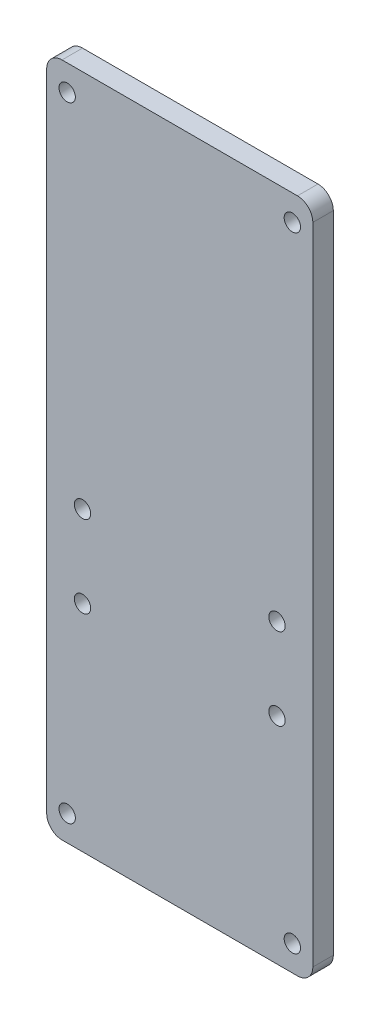
ISO-10303-21;
HEADER;
FILE_DESCRIPTION(('STEP AP214'),'2;1');
FILE_NAME('part.step','',(''),(''),'','','');
FILE_SCHEMA(('AUTOMOTIVE_DESIGN { 1 0 10303 214 1 1 1 1 }'));
ENDSEC;
DATA;
#1=APPLICATION_CONTEXT('core data for automotive mechanical design processes');
#2=APPLICATION_PROTOCOL_DEFINITION('international standard','automotive_design',2000,#1);
#3=PRODUCT_CONTEXT('',#1,'mechanical');
#4=PRODUCT('Part','Part','',(#3));
#5=PRODUCT_RELATED_PRODUCT_CATEGORY('part','',(#4));
#6=PRODUCT_DEFINITION_FORMATION('','',#4);
#7=PRODUCT_DEFINITION_CONTEXT('part definition',#1,'design');
#8=PRODUCT_DEFINITION('design','',#6,#7);
#9=PRODUCT_DEFINITION_SHAPE('','',#8);
#10=(LENGTH_UNIT() NAMED_UNIT(*) SI_UNIT(.MILLI.,.METRE.));
#11=(NAMED_UNIT(*) PLANE_ANGLE_UNIT() SI_UNIT($,.RADIAN.));
#12=(NAMED_UNIT(*) SI_UNIT($,.STERADIAN.) SOLID_ANGLE_UNIT());
#13=UNCERTAINTY_MEASURE_WITH_UNIT(LENGTH_MEASURE(1.E-05),#10,'distance_accuracy_value','');
#14=(GEOMETRIC_REPRESENTATION_CONTEXT(3) GLOBAL_UNCERTAINTY_ASSIGNED_CONTEXT((#13)) GLOBAL_UNIT_ASSIGNED_CONTEXT((#10,
#11,#12)) REPRESENTATION_CONTEXT('',''));
#15=CARTESIAN_POINT('',(0.,0.,0.));
#16=DIRECTION('',(0.,0.,1.));
#17=DIRECTION('',(1.,0.,0.));
#18=AXIS2_PLACEMENT_3D('',#15,#16,#17);
#19=CARTESIAN_POINT('',(72.2085191761689,-1.06360829735305,4.));
#20=DIRECTION('',(0.,0.,1.));
#21=DIRECTION('',(1.,0.,0.));
#22=AXIS2_PLACEMENT_3D('',#19,#20,#21);
#23=PLANE('',#22);
#24=CARTESIAN_POINT('',(71.2085191761689,0.936391702646949,4.));
#25=DIRECTION('',(0.,0.,1.));
#26=DIRECTION('',(-1.,0.,0.));
#27=AXIS2_PLACEMENT_3D('',#24,#25,#26);
#28=CIRCLE('',#27,1.60000000000001);
#29=CARTESIAN_POINT('',(69.6085191761689,0.936391702646949,4.));
#30=VERTEX_POINT('',#29);
#31=EDGE_CURVE('E211',#30,#30,#28,.T.);
#32=ORIENTED_EDGE('',*,*,#31,.F.);
#33=EDGE_LOOP('',(#32));
#34=FACE_BOUND('',#33,.T.);
#35=CARTESIAN_POINT('',(30.2077302302811,37.936391702647,4.));
#36=DIRECTION('',(0.,0.,1.));
#37=DIRECTION('',(1.,0.,0.));
#38=AXIS2_PLACEMENT_3D('',#35,#36,#37);
#39=CIRCLE('',#38,1.60000000000001);
#40=CARTESIAN_POINT('',(31.8077302302811,37.936391702647,4.));
#41=VERTEX_POINT('',#40);
#42=EDGE_CURVE('E199',#41,#41,#39,.T.);
#43=ORIENTED_EDGE('',*,*,#42,.F.);
#44=EDGE_LOOP('',(#43));
#45=FACE_BOUND('',#44,.T.);
#46=CARTESIAN_POINT('',(71.2085191761689,122.936391702647,4.));
#47=DIRECTION('',(0.,0.,1.));
#48=DIRECTION('',(1.,0.,0.));
#49=AXIS2_PLACEMENT_3D('',#46,#47,#48);
#50=CIRCLE('',#49,1.60000000000001);
#51=CARTESIAN_POINT('',(72.8085191761689,122.936391702647,4.));
#52=VERTEX_POINT('',#51);
#53=EDGE_CURVE('E187',#52,#52,#50,.T.);
#54=ORIENTED_EDGE('',*,*,#53,.F.);
#55=EDGE_LOOP('',(#54));
#56=FACE_BOUND('',#55,.T.);
#57=CARTESIAN_POINT('',(30.2077302302811,53.936391702647,4.));
#58=DIRECTION('',(0.,0.,1.));
#59=DIRECTION('',(1.,0.,0.));
#60=AXIS2_PLACEMENT_3D('',#57,#58,#59);
#61=CIRCLE('',#60,1.60000000000001);
#62=CARTESIAN_POINT('',(31.8077302302811,53.936391702647,4.));
#63=VERTEX_POINT('',#62);
#64=EDGE_CURVE('E133',#63,#63,#61,.T.);
#65=ORIENTED_EDGE('',*,*,#64,.F.);
#66=EDGE_LOOP('',(#65));
#67=FACE_BOUND('',#66,.T.);
#68=CARTESIAN_POINT('',(72.2085191761689,-1.06360829735305,4.));
#69=DIRECTION('',(0.,0.,1.));
#70=DIRECTION('',(1.,0.,0.));
#71=AXIS2_PLACEMENT_3D('',#68,#69,#70);
#72=CIRCLE('',#71,2.99999999999999);
#73=CARTESIAN_POINT('',(72.2085191761689,-4.06360829735305,4.));
#74=VERTEX_POINT('',#73);
#75=CARTESIAN_POINT('',(75.2085191761689,-1.06360829735305,4.));
#76=VERTEX_POINT('',#75);
#77=EDGE_CURVE('E144',#74,#76,#72,.T.);
#78=ORIENTED_EDGE('',*,*,#77,.T.);
#79=DIRECTION('',(0.,1.,0.));
#80=VECTOR('',#79,1.);
#81=CARTESIAN_POINT('',(75.2085191761689,124.936391702647,4.));
#82=LINE('',#81,#80);
#83=CARTESIAN_POINT('',(75.2085191761689,124.936391702647,4.));
#84=VERTEX_POINT('',#83);
#85=EDGE_CURVE('E92',#76,#84,#82,.T.);
#86=ORIENTED_EDGE('',*,*,#85,.T.);
#87=CARTESIAN_POINT('',(72.2085191761689,124.936391702647,4.));
#88=DIRECTION('',(0.,0.,1.));
#89=DIRECTION('',(-1.,0.,0.));
#90=AXIS2_PLACEMENT_3D('',#87,#88,#89);
#91=CIRCLE('',#90,3.);
#92=CARTESIAN_POINT('',(72.2085191761689,127.936391702647,4.));
#93=VERTEX_POINT('',#92);
#94=EDGE_CURVE('E159',#84,#93,#91,.T.);
#95=ORIENTED_EDGE('',*,*,#94,.T.);
#96=DIRECTION('',(-1.,0.,0.));
#97=VECTOR('',#96,1.);
#98=CARTESIAN_POINT('',(26.2069412843933,127.936391702647,4.));
#99=LINE('',#98,#97);
#100=CARTESIAN_POINT('',(26.2069412843933,127.936391702647,4.));
#101=VERTEX_POINT('',#100);
#102=EDGE_CURVE('E172',#93,#101,#99,.T.);
#103=ORIENTED_EDGE('',*,*,#102,.T.);
#104=CARTESIAN_POINT('',(26.2069412843933,124.936391702647,4.));
#105=DIRECTION('',(0.,0.,1.));
#106=DIRECTION('',(1.,0.,0.));
#107=AXIS2_PLACEMENT_3D('',#104,#105,#106);
#108=CIRCLE('',#107,3.);
#109=CARTESIAN_POINT('',(23.2069412843933,124.936391702647,4.));
#110=VERTEX_POINT('',#109);
#111=EDGE_CURVE('E111',#101,#110,#108,.T.);
#112=ORIENTED_EDGE('',*,*,#111,.T.);
#113=DIRECTION('',(0.,-1.,0.));
#114=VECTOR('',#113,1.);
#115=CARTESIAN_POINT('',(23.2069412843933,124.936391702647,4.));
#116=LINE('',#115,#114);
#117=CARTESIAN_POINT('',(23.2069412843933,-1.06360829735305,4.));
#118=VERTEX_POINT('',#117);
#119=EDGE_CURVE('E105',#110,#118,#116,.T.);
#120=ORIENTED_EDGE('',*,*,#119,.T.);
#121=CARTESIAN_POINT('',(26.2069412843933,-1.06360829735305,4.));
#122=DIRECTION('',(0.,0.,1.));
#123=DIRECTION('',(-1.,0.,0.));
#124=AXIS2_PLACEMENT_3D('',#121,#122,#123);
#125=CIRCLE('',#124,2.99999999999999);
#126=CARTESIAN_POINT('',(26.2069412843933,-4.06360829735305,4.));
#127=VERTEX_POINT('',#126);
#128=EDGE_CURVE('E109',#118,#127,#125,.T.);
#129=ORIENTED_EDGE('',*,*,#128,.T.);
#130=DIRECTION('',(1.,0.,0.));
#131=VECTOR('',#130,1.);
#132=CARTESIAN_POINT('',(26.2069412843933,-4.06360829735305,4.));
#133=LINE('',#132,#131);
#134=EDGE_CURVE('E49',#127,#74,#133,.T.);
#135=ORIENTED_EDGE('',*,*,#134,.T.);
#136=EDGE_LOOP('',(#78,#86,#95,#103,#112,#120,#129,#135));
#137=FACE_BOUND('',#136,.T.);
#138=CARTESIAN_POINT('',(27.2069412843933,0.936391702646949,4.));
#139=DIRECTION('',(0.,0.,1.));
#140=DIRECTION('',(1.,0.,0.));
#141=AXIS2_PLACEMENT_3D('',#138,#139,#140);
#142=CIRCLE('',#141,1.60000000000001);
#143=CARTESIAN_POINT('',(28.8069412843933,0.936391702646949,4.));
#144=VERTEX_POINT('',#143);
#145=EDGE_CURVE('E181',#144,#144,#142,.T.);
#146=ORIENTED_EDGE('',*,*,#145,.F.);
#147=EDGE_LOOP('',(#146));
#148=FACE_BOUND('',#147,.T.);
#149=CARTESIAN_POINT('',(27.2069412843933,122.936391702647,4.));
#150=DIRECTION('',(0.,0.,1.));
#151=DIRECTION('',(-1.,0.,0.));
#152=AXIS2_PLACEMENT_3D('',#149,#150,#151);
#153=CIRCLE('',#152,1.60000000000001);
#154=CARTESIAN_POINT('',(25.6069412843933,122.936391702647,4.));
#155=VERTEX_POINT('',#154);
#156=EDGE_CURVE('E193',#155,#155,#153,.T.);
#157=ORIENTED_EDGE('',*,*,#156,.F.);
#158=EDGE_LOOP('',(#157));
#159=FACE_BOUND('',#158,.T.);
#160=CARTESIAN_POINT('',(68.2077302302811,37.936391702647,4.));
#161=DIRECTION('',(0.,0.,1.));
#162=DIRECTION('',(1.,0.,0.));
#163=AXIS2_PLACEMENT_3D('',#160,#161,#162);
#164=CIRCLE('',#163,1.60000000000001);
#165=CARTESIAN_POINT('',(69.8077302302811,37.936391702647,4.));
#166=VERTEX_POINT('',#165);
#167=EDGE_CURVE('E205',#166,#166,#164,.T.);
#168=ORIENTED_EDGE('',*,*,#167,.F.);
#169=EDGE_LOOP('',(#168));
#170=FACE_BOUND('',#169,.T.);
#171=CARTESIAN_POINT('',(68.2077302302811,53.936391702647,4.));
#172=DIRECTION('',(0.,0.,1.));
#173=DIRECTION('',(-1.,0.,0.));
#174=AXIS2_PLACEMENT_3D('',#171,#172,#173);
#175=CIRCLE('',#174,1.60000000000001);
#176=CARTESIAN_POINT('',(66.6077302302811,53.936391702647,4.));
#177=VERTEX_POINT('',#176);
#178=EDGE_CURVE('E217',#177,#177,#175,.T.);
#179=ORIENTED_EDGE('',*,*,#178,.F.);
#180=EDGE_LOOP('',(#179));
#181=FACE_BOUND('',#180,.T.);
#182=ADVANCED_FACE('F32',(#34,#45,#56,#67,#137,#148,#159,#170,#181),#23,.T.);
#183=CARTESIAN_POINT('',(72.2085191761689,-1.06360829735305,0.));
#184=DIRECTION('',(0.,0.,1.));
#185=DIRECTION('',(1.,0.,0.));
#186=AXIS2_PLACEMENT_3D('',#183,#184,#185);
#187=PLANE('',#186);
#188=CARTESIAN_POINT('',(71.2085191761689,0.936391702646949,0.));
#189=DIRECTION('',(0.,0.,1.));
#190=DIRECTION('',(-1.,0.,0.));
#191=AXIS2_PLACEMENT_3D('',#188,#189,#190);
#192=CIRCLE('',#191,1.60000000000001);
#193=CARTESIAN_POINT('',(69.6085191761689,0.936391702646949,0.));
#194=VERTEX_POINT('',#193);
#195=EDGE_CURVE('E214',#194,#194,#192,.T.);
#196=ORIENTED_EDGE('',*,*,#195,.T.);
#197=EDGE_LOOP('',(#196));
#198=FACE_BOUND('',#197,.T.);
#199=CARTESIAN_POINT('',(30.2077302302811,37.936391702647,0.));
#200=DIRECTION('',(0.,0.,1.));
#201=DIRECTION('',(1.,0.,0.));
#202=AXIS2_PLACEMENT_3D('',#199,#200,#201);
#203=CIRCLE('',#202,1.60000000000001);
#204=CARTESIAN_POINT('',(31.8077302302811,37.936391702647,0.));
#205=VERTEX_POINT('',#204);
#206=EDGE_CURVE('E202',#205,#205,#203,.T.);
#207=ORIENTED_EDGE('',*,*,#206,.T.);
#208=EDGE_LOOP('',(#207));
#209=FACE_BOUND('',#208,.T.);
#210=CARTESIAN_POINT('',(71.2085191761689,122.936391702647,0.));
#211=DIRECTION('',(0.,0.,1.));
#212=DIRECTION('',(1.,0.,0.));
#213=AXIS2_PLACEMENT_3D('',#210,#211,#212);
#214=CIRCLE('',#213,1.60000000000001);
#215=CARTESIAN_POINT('',(72.8085191761689,122.936391702647,0.));
#216=VERTEX_POINT('',#215);
#217=EDGE_CURVE('E190',#216,#216,#214,.T.);
#218=ORIENTED_EDGE('',*,*,#217,.T.);
#219=EDGE_LOOP('',(#218));
#220=FACE_BOUND('',#219,.T.);
#221=CARTESIAN_POINT('',(30.2077302302811,53.936391702647,0.));
#222=DIRECTION('',(0.,0.,1.));
#223=DIRECTION('',(1.,0.,0.));
#224=AXIS2_PLACEMENT_3D('',#221,#222,#223);
#225=CIRCLE('',#224,1.60000000000001);
#226=CARTESIAN_POINT('',(31.8077302302811,53.936391702647,0.));
#227=VERTEX_POINT('',#226);
#228=EDGE_CURVE('E178',#227,#227,#225,.T.);
#229=ORIENTED_EDGE('',*,*,#228,.T.);
#230=EDGE_LOOP('',(#229));
#231=FACE_BOUND('',#230,.T.);
#232=CARTESIAN_POINT('',(72.2085191761689,-1.06360829735305,0.));
#233=DIRECTION('',(0.,0.,1.));
#234=DIRECTION('',(1.,0.,0.));
#235=AXIS2_PLACEMENT_3D('',#232,#233,#234);
#236=CIRCLE('',#235,2.99999999999999);
#237=CARTESIAN_POINT('',(72.2085191761689,-4.06360829735305,0.));
#238=VERTEX_POINT('',#237);
#239=CARTESIAN_POINT('',(75.2085191761689,-1.06360829735305,0.));
#240=VERTEX_POINT('',#239);
#241=EDGE_CURVE('E129',#238,#240,#236,.T.);
#242=ORIENTED_EDGE('',*,*,#241,.F.);
#243=DIRECTION('',(1.,0.,0.));
#244=VECTOR('',#243,1.);
#245=CARTESIAN_POINT('',(26.2069412843933,-4.06360829735305,0.));
#246=LINE('',#245,#244);
#247=CARTESIAN_POINT('',(26.2069412843933,-4.06360829735305,0.));
#248=VERTEX_POINT('',#247);
#249=EDGE_CURVE('E84',#248,#238,#246,.T.);
#250=ORIENTED_EDGE('',*,*,#249,.F.);
#251=CARTESIAN_POINT('',(26.2069412843933,-1.06360829735305,0.));
#252=DIRECTION('',(0.,0.,1.));
#253=DIRECTION('',(-1.,0.,0.));
#254=AXIS2_PLACEMENT_3D('',#251,#252,#253);
#255=CIRCLE('',#254,2.99999999999999);
#256=CARTESIAN_POINT('',(23.2069412843933,-1.06360829735305,0.));
#257=VERTEX_POINT('',#256);
#258=EDGE_CURVE('E78',#257,#248,#255,.T.);
#259=ORIENTED_EDGE('',*,*,#258,.F.);
#260=DIRECTION('',(0.,-1.,0.));
#261=VECTOR('',#260,1.);
#262=CARTESIAN_POINT('',(23.2069412843933,124.936391702647,0.));
#263=LINE('',#262,#261);
#264=CARTESIAN_POINT('',(23.2069412843933,124.936391702647,0.));
#265=VERTEX_POINT('',#264);
#266=EDGE_CURVE('E119',#265,#257,#263,.T.);
#267=ORIENTED_EDGE('',*,*,#266,.F.);
#268=CARTESIAN_POINT('',(26.2069412843933,124.936391702647,0.));
#269=DIRECTION('',(0.,0.,1.));
#270=DIRECTION('',(1.,0.,0.));
#271=AXIS2_PLACEMENT_3D('',#268,#269,#270);
#272=CIRCLE('',#271,3.);
#273=CARTESIAN_POINT('',(26.2069412843933,127.936391702647,0.));
#274=VERTEX_POINT('',#273);
#275=EDGE_CURVE('E139',#274,#265,#272,.T.);
#276=ORIENTED_EDGE('',*,*,#275,.F.);
#277=DIRECTION('',(-1.,0.,0.));
#278=VECTOR('',#277,1.);
#279=CARTESIAN_POINT('',(26.2069412843933,127.936391702647,0.));
#280=LINE('',#279,#278);
#281=CARTESIAN_POINT('',(72.2085191761689,127.936391702647,0.));
#282=VERTEX_POINT('',#281);
#283=EDGE_CURVE('E137',#282,#274,#280,.T.);
#284=ORIENTED_EDGE('',*,*,#283,.F.);
#285=CARTESIAN_POINT('',(72.2085191761689,124.936391702647,0.));
#286=DIRECTION('',(0.,0.,1.));
#287=DIRECTION('',(-1.,0.,0.));
#288=AXIS2_PLACEMENT_3D('',#285,#286,#287);
#289=CIRCLE('',#288,3.);
#290=CARTESIAN_POINT('',(75.2085191761689,124.936391702647,0.));
#291=VERTEX_POINT('',#290);
#292=EDGE_CURVE('E135',#291,#282,#289,.T.);
#293=ORIENTED_EDGE('',*,*,#292,.F.);
#294=DIRECTION('',(0.,1.,0.));
#295=VECTOR('',#294,1.);
#296=CARTESIAN_POINT('',(75.2085191761689,124.936391702647,0.));
#297=LINE('',#296,#295);
#298=EDGE_CURVE('E132',#240,#291,#297,.T.);
#299=ORIENTED_EDGE('',*,*,#298,.F.);
#300=EDGE_LOOP('',(#242,#250,#259,#267,#276,#284,#293,#299));
#301=FACE_BOUND('',#300,.T.);
#302=CARTESIAN_POINT('',(27.2069412843933,0.936391702646949,0.));
#303=DIRECTION('',(0.,0.,1.));
#304=DIRECTION('',(1.,0.,0.));
#305=AXIS2_PLACEMENT_3D('',#302,#303,#304);
#306=CIRCLE('',#305,1.60000000000001);
#307=CARTESIAN_POINT('',(28.8069412843933,0.936391702646949,0.));
#308=VERTEX_POINT('',#307);
#309=EDGE_CURVE('E184',#308,#308,#306,.T.);
#310=ORIENTED_EDGE('',*,*,#309,.T.);
#311=EDGE_LOOP('',(#310));
#312=FACE_BOUND('',#311,.T.);
#313=CARTESIAN_POINT('',(27.2069412843933,122.936391702647,0.));
#314=DIRECTION('',(0.,0.,1.));
#315=DIRECTION('',(-1.,0.,0.));
#316=AXIS2_PLACEMENT_3D('',#313,#314,#315);
#317=CIRCLE('',#316,1.60000000000001);
#318=CARTESIAN_POINT('',(25.6069412843933,122.936391702647,0.));
#319=VERTEX_POINT('',#318);
#320=EDGE_CURVE('E196',#319,#319,#317,.T.);
#321=ORIENTED_EDGE('',*,*,#320,.T.);
#322=EDGE_LOOP('',(#321));
#323=FACE_BOUND('',#322,.T.);
#324=CARTESIAN_POINT('',(68.2077302302811,37.936391702647,0.));
#325=DIRECTION('',(0.,0.,1.));
#326=DIRECTION('',(1.,0.,0.));
#327=AXIS2_PLACEMENT_3D('',#324,#325,#326);
#328=CIRCLE('',#327,1.60000000000001);
#329=CARTESIAN_POINT('',(69.8077302302811,37.936391702647,0.));
#330=VERTEX_POINT('',#329);
#331=EDGE_CURVE('E208',#330,#330,#328,.T.);
#332=ORIENTED_EDGE('',*,*,#331,.T.);
#333=EDGE_LOOP('',(#332));
#334=FACE_BOUND('',#333,.T.);
#335=CARTESIAN_POINT('',(68.2077302302811,53.936391702647,0.));
#336=DIRECTION('',(0.,0.,1.));
#337=DIRECTION('',(-1.,0.,0.));
#338=AXIS2_PLACEMENT_3D('',#335,#336,#337);
#339=CIRCLE('',#338,1.60000000000001);
#340=CARTESIAN_POINT('',(66.6077302302811,53.936391702647,0.));
#341=VERTEX_POINT('',#340);
#342=EDGE_CURVE('E220',#341,#341,#339,.T.);
#343=ORIENTED_EDGE('',*,*,#342,.T.);
#344=EDGE_LOOP('',(#343));
#345=FACE_BOUND('',#344,.T.);
#346=ADVANCED_FACE('F163',(#198,#209,#220,#231,#301,#312,#323,#334,#345),#187,.F.);
#347=CARTESIAN_POINT('',(72.2085191761689,-1.06360829735305,4.));
#348=DIRECTION('',(0.,0.,-1.));
#349=DIRECTION('',(-1.,0.,0.));
#350=AXIS2_PLACEMENT_3D('',#347,#348,#349);
#351=CYLINDRICAL_SURFACE('',#350,2.99999999999999);
#352=ORIENTED_EDGE('',*,*,#241,.T.);
#353=DIRECTION('',(0.,0.,-1.));
#354=VECTOR('',#353,1.);
#355=CARTESIAN_POINT('',(75.2085191761689,-1.06360829735305,4.));
#356=LINE('',#355,#354);
#357=EDGE_CURVE('E11',#76,#240,#356,.T.);
#358=ORIENTED_EDGE('',*,*,#357,.F.);
#359=ORIENTED_EDGE('',*,*,#77,.F.);
#360=DIRECTION('',(0.,0.,-1.));
#361=VECTOR('',#360,1.);
#362=CARTESIAN_POINT('',(72.2085191761689,-4.06360829735305,4.));
#363=LINE('',#362,#361);
#364=EDGE_CURVE('E125',#74,#238,#363,.T.);
#365=ORIENTED_EDGE('',*,*,#364,.T.);
#366=EDGE_LOOP('',(#352,#358,#359,#365));
#367=FACE_BOUND('',#366,.T.);
#368=ADVANCED_FACE('F34',(#367),#351,.T.);
#369=CARTESIAN_POINT('',(75.2085191761689,124.936391702647,4.));
#370=DIRECTION('',(-1.,0.,0.));
#371=DIRECTION('',(0.,-1.,0.));
#372=AXIS2_PLACEMENT_3D('',#369,#370,#371);
#373=PLANE('',#372);
#374=ORIENTED_EDGE('',*,*,#298,.T.);
#375=DIRECTION('',(0.,0.,-1.));
#376=VECTOR('',#375,1.);
#377=CARTESIAN_POINT('',(75.2085191761689,124.936391702647,4.));
#378=LINE('',#377,#376);
#379=EDGE_CURVE('E41',#84,#291,#378,.T.);
#380=ORIENTED_EDGE('',*,*,#379,.F.);
#381=ORIENTED_EDGE('',*,*,#85,.F.);
#382=ORIENTED_EDGE('',*,*,#357,.T.);
#383=EDGE_LOOP('',(#374,#380,#381,#382));
#384=FACE_BOUND('',#383,.T.);
#385=ADVANCED_FACE('F255',(#384),#373,.F.);
#386=CARTESIAN_POINT('',(72.2085191761689,124.936391702647,4.));
#387=DIRECTION('',(0.,0.,-1.));
#388=DIRECTION('',(-1.,0.,0.));
#389=AXIS2_PLACEMENT_3D('',#386,#387,#388);
#390=CYLINDRICAL_SURFACE('',#389,3.);
#391=ORIENTED_EDGE('',*,*,#292,.T.);
#392=DIRECTION('',(0.,0.,-1.));
#393=VECTOR('',#392,1.);
#394=CARTESIAN_POINT('',(72.2085191761689,127.936391702647,4.));
#395=LINE('',#394,#393);
#396=EDGE_CURVE('E151',#93,#282,#395,.T.);
#397=ORIENTED_EDGE('',*,*,#396,.F.);
#398=ORIENTED_EDGE('',*,*,#94,.F.);
#399=ORIENTED_EDGE('',*,*,#379,.T.);
#400=EDGE_LOOP('',(#391,#397,#398,#399));
#401=FACE_BOUND('',#400,.T.);
#402=ADVANCED_FACE('F157',(#401),#390,.T.);
#403=CARTESIAN_POINT('',(26.2069412843933,127.936391702647,4.));
#404=DIRECTION('',(0.,-1.,0.));
#405=DIRECTION('',(0.,0.,-1.));
#406=AXIS2_PLACEMENT_3D('',#403,#404,#405);
#407=PLANE('',#406);
#408=ORIENTED_EDGE('',*,*,#283,.T.);
#409=DIRECTION('',(0.,0.,-1.));
#410=VECTOR('',#409,1.);
#411=CARTESIAN_POINT('',(26.2069412843933,127.936391702647,4.));
#412=LINE('',#411,#410);
#413=EDGE_CURVE('E148',#101,#274,#412,.T.);
#414=ORIENTED_EDGE('',*,*,#413,.F.);
#415=ORIENTED_EDGE('',*,*,#102,.F.);
#416=ORIENTED_EDGE('',*,*,#396,.T.);
#417=EDGE_LOOP('',(#408,#414,#415,#416));
#418=FACE_BOUND('',#417,.T.);
#419=ADVANCED_FACE('F168',(#418),#407,.F.);
#420=CARTESIAN_POINT('',(26.2069412843933,124.936391702647,4.));
#421=DIRECTION('',(0.,0.,-1.));
#422=DIRECTION('',(-1.,0.,0.));
#423=AXIS2_PLACEMENT_3D('',#420,#421,#422);
#424=CYLINDRICAL_SURFACE('',#423,3.);
#425=ORIENTED_EDGE('',*,*,#275,.T.);
#426=DIRECTION('',(0.,0.,-1.));
#427=VECTOR('',#426,1.);
#428=CARTESIAN_POINT('',(23.2069412843933,124.936391702647,4.));
#429=LINE('',#428,#427);
#430=EDGE_CURVE('E120',#110,#265,#429,.T.);
#431=ORIENTED_EDGE('',*,*,#430,.F.);
#432=ORIENTED_EDGE('',*,*,#111,.F.);
#433=ORIENTED_EDGE('',*,*,#413,.T.);
#434=EDGE_LOOP('',(#425,#431,#432,#433));
#435=FACE_BOUND('',#434,.T.);
#436=ADVANCED_FACE('F171',(#435),#424,.T.);
#437=CARTESIAN_POINT('',(23.2069412843933,124.936391702647,4.));
#438=DIRECTION('',(1.,0.,0.));
#439=DIRECTION('',(0.,1.,0.));
#440=AXIS2_PLACEMENT_3D('',#437,#438,#439);
#441=PLANE('',#440);
#442=ORIENTED_EDGE('',*,*,#266,.T.);
#443=DIRECTION('',(0.,0.,-1.));
#444=VECTOR('',#443,1.);
#445=CARTESIAN_POINT('',(23.2069412843933,-1.06360829735305,4.));
#446=LINE('',#445,#444);
#447=EDGE_CURVE('E116',#118,#257,#446,.T.);
#448=ORIENTED_EDGE('',*,*,#447,.F.);
#449=ORIENTED_EDGE('',*,*,#119,.F.);
#450=ORIENTED_EDGE('',*,*,#430,.T.);
#451=EDGE_LOOP('',(#442,#448,#449,#450));
#452=FACE_BOUND('',#451,.T.);
#453=ADVANCED_FACE('F117',(#452),#441,.F.);
#454=CARTESIAN_POINT('',(26.2069412843933,-1.06360829735305,4.));
#455=DIRECTION('',(0.,0.,-1.));
#456=DIRECTION('',(-1.,0.,0.));
#457=AXIS2_PLACEMENT_3D('',#454,#455,#456);
#458=CYLINDRICAL_SURFACE('',#457,2.99999999999999);
#459=ORIENTED_EDGE('',*,*,#258,.T.);
#460=DIRECTION('',(0.,0.,-1.));
#461=VECTOR('',#460,1.);
#462=CARTESIAN_POINT('',(26.2069412843933,-4.06360829735305,4.));
#463=LINE('',#462,#461);
#464=EDGE_CURVE('E121',#127,#248,#463,.T.);
#465=ORIENTED_EDGE('',*,*,#464,.F.);
#466=ORIENTED_EDGE('',*,*,#128,.F.);
#467=ORIENTED_EDGE('',*,*,#447,.T.);
#468=EDGE_LOOP('',(#459,#465,#466,#467));
#469=FACE_BOUND('',#468,.T.);
#470=ADVANCED_FACE('F123',(#469),#458,.T.);
#471=CARTESIAN_POINT('',(26.2069412843933,-4.06360829735305,4.));
#472=DIRECTION('',(0.,1.,0.));
#473=DIRECTION('',(0.,0.,1.));
#474=AXIS2_PLACEMENT_3D('',#471,#472,#473);
#475=PLANE('',#474);
#476=ORIENTED_EDGE('',*,*,#249,.T.);
#477=ORIENTED_EDGE('',*,*,#364,.F.);
#478=ORIENTED_EDGE('',*,*,#134,.F.);
#479=ORIENTED_EDGE('',*,*,#464,.T.);
#480=EDGE_LOOP('',(#476,#477,#478,#479));
#481=FACE_BOUND('',#480,.T.);
#482=ADVANCED_FACE('F243',(#481),#475,.F.);
#483=CARTESIAN_POINT('',(30.2077302302811,53.936391702647,4.));
#484=DIRECTION('',(0.,0.,-1.));
#485=DIRECTION('',(-1.,0.,0.));
#486=AXIS2_PLACEMENT_3D('',#483,#484,#485);
#487=CYLINDRICAL_SURFACE('',#486,1.60000000000001);
#488=ORIENTED_EDGE('',*,*,#64,.T.);
#489=EDGE_LOOP('',(#488));
#490=FACE_BOUND('',#489,.T.);
#491=ORIENTED_EDGE('',*,*,#228,.F.);
#492=EDGE_LOOP('',(#491));
#493=FACE_BOUND('',#492,.T.);
#494=ADVANCED_FACE('F240',(#490,#493),#487,.F.);
#495=CARTESIAN_POINT('',(27.2069412843933,0.936391702646949,4.));
#496=DIRECTION('',(0.,0.,-1.));
#497=DIRECTION('',(-1.,0.,0.));
#498=AXIS2_PLACEMENT_3D('',#495,#496,#497);
#499=CYLINDRICAL_SURFACE('',#498,1.60000000000001);
#500=ORIENTED_EDGE('',*,*,#145,.T.);
#501=EDGE_LOOP('',(#500));
#502=FACE_BOUND('',#501,.T.);
#503=ORIENTED_EDGE('',*,*,#309,.F.);
#504=EDGE_LOOP('',(#503));
#505=FACE_BOUND('',#504,.T.);
#506=ADVANCED_FACE('F319',(#502,#505),#499,.F.);
#507=CARTESIAN_POINT('',(71.2085191761689,122.936391702647,4.));
#508=DIRECTION('',(0.,0.,-1.));
#509=DIRECTION('',(-1.,0.,0.));
#510=AXIS2_PLACEMENT_3D('',#507,#508,#509);
#511=CYLINDRICAL_SURFACE('',#510,1.60000000000001);
#512=ORIENTED_EDGE('',*,*,#53,.T.);
#513=EDGE_LOOP('',(#512));
#514=FACE_BOUND('',#513,.T.);
#515=ORIENTED_EDGE('',*,*,#217,.F.);
#516=EDGE_LOOP('',(#515));
#517=FACE_BOUND('',#516,.T.);
#518=ADVANCED_FACE('F327',(#514,#517),#511,.F.);
#519=CARTESIAN_POINT('',(27.2069412843933,122.936391702647,4.));
#520=DIRECTION('',(0.,0.,-1.));
#521=DIRECTION('',(-1.,0.,0.));
#522=AXIS2_PLACEMENT_3D('',#519,#520,#521);
#523=CYLINDRICAL_SURFACE('',#522,1.60000000000001);
#524=ORIENTED_EDGE('',*,*,#156,.T.);
#525=EDGE_LOOP('',(#524));
#526=FACE_BOUND('',#525,.T.);
#527=ORIENTED_EDGE('',*,*,#320,.F.);
#528=EDGE_LOOP('',(#527));
#529=FACE_BOUND('',#528,.T.);
#530=ADVANCED_FACE('F335',(#526,#529),#523,.F.);
#531=CARTESIAN_POINT('',(30.2077302302811,37.936391702647,4.));
#532=DIRECTION('',(0.,0.,-1.));
#533=DIRECTION('',(-1.,0.,0.));
#534=AXIS2_PLACEMENT_3D('',#531,#532,#533);
#535=CYLINDRICAL_SURFACE('',#534,1.60000000000001);
#536=ORIENTED_EDGE('',*,*,#42,.T.);
#537=EDGE_LOOP('',(#536));
#538=FACE_BOUND('',#537,.T.);
#539=ORIENTED_EDGE('',*,*,#206,.F.);
#540=EDGE_LOOP('',(#539));
#541=FACE_BOUND('',#540,.T.);
#542=ADVANCED_FACE('F344',(#538,#541),#535,.F.);
#543=CARTESIAN_POINT('',(68.2077302302811,37.936391702647,4.));
#544=DIRECTION('',(0.,0.,-1.));
#545=DIRECTION('',(-1.,0.,0.));
#546=AXIS2_PLACEMENT_3D('',#543,#544,#545);
#547=CYLINDRICAL_SURFACE('',#546,1.60000000000001);
#548=ORIENTED_EDGE('',*,*,#167,.T.);
#549=EDGE_LOOP('',(#548));
#550=FACE_BOUND('',#549,.T.);
#551=ORIENTED_EDGE('',*,*,#331,.F.);
#552=EDGE_LOOP('',(#551));
#553=FACE_BOUND('',#552,.T.);
#554=ADVANCED_FACE('F353',(#550,#553),#547,.F.);
#555=CARTESIAN_POINT('',(71.2085191761689,0.936391702646949,4.));
#556=DIRECTION('',(0.,0.,-1.));
#557=DIRECTION('',(-1.,0.,0.));
#558=AXIS2_PLACEMENT_3D('',#555,#556,#557);
#559=CYLINDRICAL_SURFACE('',#558,1.60000000000001);
#560=ORIENTED_EDGE('',*,*,#31,.T.);
#561=EDGE_LOOP('',(#560));
#562=FACE_BOUND('',#561,.T.);
#563=ORIENTED_EDGE('',*,*,#195,.F.);
#564=EDGE_LOOP('',(#563));
#565=FACE_BOUND('',#564,.T.);
#566=ADVANCED_FACE('F362',(#562,#565),#559,.F.);
#567=CARTESIAN_POINT('',(68.2077302302811,53.936391702647,4.));
#568=DIRECTION('',(0.,0.,-1.));
#569=DIRECTION('',(-1.,0.,0.));
#570=AXIS2_PLACEMENT_3D('',#567,#568,#569);
#571=CYLINDRICAL_SURFACE('',#570,1.60000000000001);
#572=ORIENTED_EDGE('',*,*,#178,.T.);
#573=EDGE_LOOP('',(#572));
#574=FACE_BOUND('',#573,.T.);
#575=ORIENTED_EDGE('',*,*,#342,.F.);
#576=EDGE_LOOP('',(#575));
#577=FACE_BOUND('',#576,.T.);
#578=ADVANCED_FACE('F226',(#574,#577),#571,.F.);
#579=CLOSED_SHELL('',(#182,#346,#368,#385,#402,#419,#436,#453,#470,#482,#494,#506,#518,#530,
#542,#554,#566,#578));
#580=MANIFOLD_SOLID_BREP('B2',#579);
#581=ADVANCED_BREP_SHAPE_REPRESENTATION('',(#18,#580),#14);
#582=SHAPE_DEFINITION_REPRESENTATION(#9,#581);
ENDSEC;
END-ISO-10303-21;
